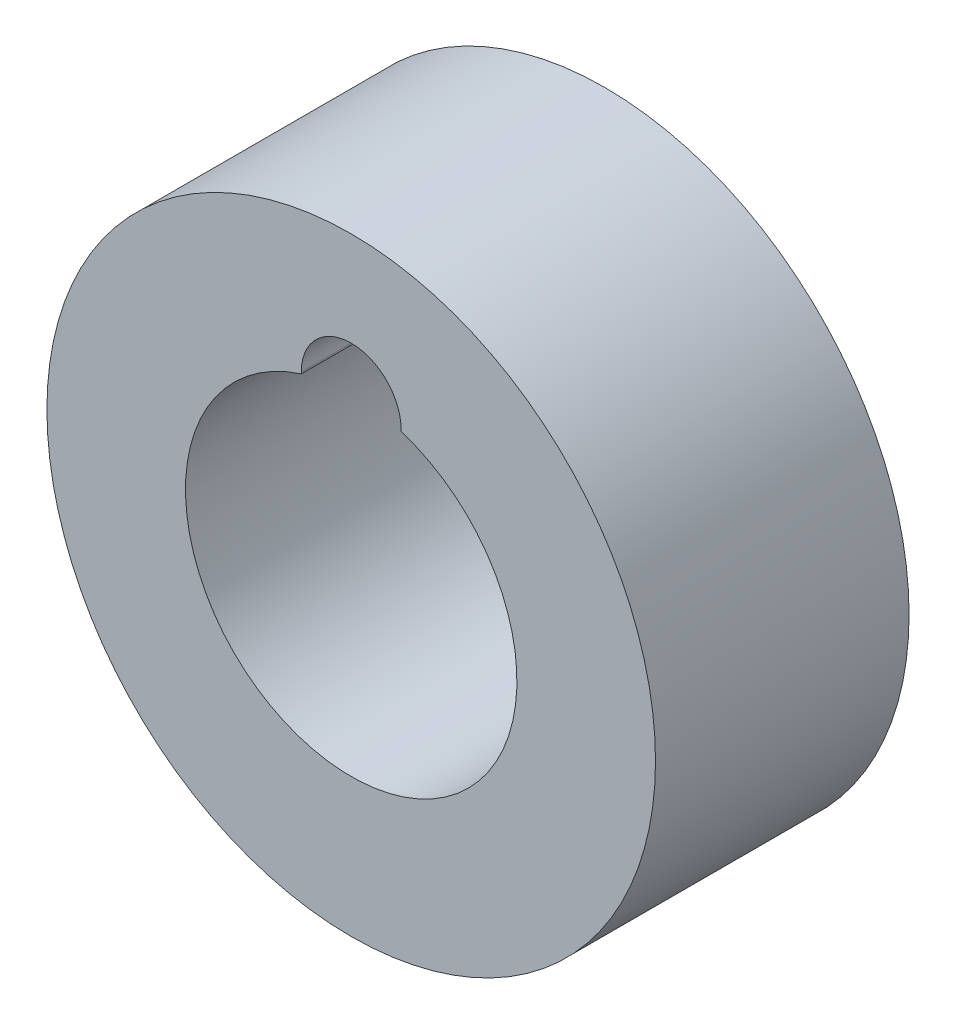
ISO-10303-21;
HEADER;
FILE_DESCRIPTION(('STEP AP214'),'2;1');
FILE_NAME('part.step','',(''),(''),'','','');
FILE_SCHEMA(('AUTOMOTIVE_DESIGN { 1 0 10303 214 1 1 1 1 }'));
ENDSEC;
DATA;
#1=APPLICATION_CONTEXT('core data for automotive mechanical design processes');
#2=APPLICATION_PROTOCOL_DEFINITION('international standard','automotive_design',2000,#1);
#3=PRODUCT_CONTEXT('',#1,'mechanical');
#4=PRODUCT('Part','Part','',(#3));
#5=PRODUCT_RELATED_PRODUCT_CATEGORY('part','',(#4));
#6=PRODUCT_DEFINITION_FORMATION('','',#4);
#7=PRODUCT_DEFINITION_CONTEXT('part definition',#1,'design');
#8=PRODUCT_DEFINITION('design','',#6,#7);
#9=PRODUCT_DEFINITION_SHAPE('','',#8);
#10=(LENGTH_UNIT() NAMED_UNIT(*) SI_UNIT(.MILLI.,.METRE.));
#11=(NAMED_UNIT(*) PLANE_ANGLE_UNIT() SI_UNIT($,.RADIAN.));
#12=(NAMED_UNIT(*) SI_UNIT($,.STERADIAN.) SOLID_ANGLE_UNIT());
#13=UNCERTAINTY_MEASURE_WITH_UNIT(LENGTH_MEASURE(1.E-05),#10,'distance_accuracy_value','');
#14=(GEOMETRIC_REPRESENTATION_CONTEXT(3) GLOBAL_UNCERTAINTY_ASSIGNED_CONTEXT((#13)) GLOBAL_UNIT_ASSIGNED_CONTEXT((#10,
#11,#12)) REPRESENTATION_CONTEXT('',''));
#15=CARTESIAN_POINT('',(0.,0.,0.));
#16=DIRECTION('',(0.,0.,1.));
#17=DIRECTION('',(1.,0.,0.));
#18=AXIS2_PLACEMENT_3D('',#15,#16,#17);
#19=CARTESIAN_POINT('',(0.,0.,6.35));
#20=DIRECTION('',(0.,0.,1.));
#21=DIRECTION('',(1.,0.,0.));
#22=AXIS2_PLACEMENT_3D('',#19,#20,#21);
#23=PLANE('',#22);
#24=DIRECTION('',(0.,-1.,0.));
#25=VECTOR('',#24,1.);
#26=CARTESIAN_POINT('',(-1.25,0.,6.35));
#27=LINE('',#26,#25);
#28=CARTESIAN_POINT('',(-1.25,4.,6.35));
#29=VERTEX_POINT('',#28);
#30=CARTESIAN_POINT('',(-1.25,3.95727178748188,6.35));
#31=VERTEX_POINT('',#30);
#32=EDGE_CURVE('E99',#29,#31,#27,.T.);
#33=ORIENTED_EDGE('',*,*,#32,.F.);
#34=CARTESIAN_POINT('',(0.,4.,6.35));
#35=DIRECTION('',(0.,0.,1.));
#36=DIRECTION('',(1.,0.,0.));
#37=AXIS2_PLACEMENT_3D('',#34,#35,#36);
#38=CIRCLE('',#37,1.25);
#39=CARTESIAN_POINT('',(1.25,4.,6.35));
#40=VERTEX_POINT('',#39);
#41=EDGE_CURVE('E103',#40,#29,#38,.T.);
#42=ORIENTED_EDGE('',*,*,#41,.F.);
#43=DIRECTION('',(0.,1.,0.));
#44=VECTOR('',#43,1.);
#45=CARTESIAN_POINT('',(1.25,0.,6.35));
#46=LINE('',#45,#44);
#47=CARTESIAN_POINT('',(1.25,3.95727178748188,6.35));
#48=VERTEX_POINT('',#47);
#49=EDGE_CURVE('E80',#48,#40,#46,.T.);
#50=ORIENTED_EDGE('',*,*,#49,.F.);
#51=CARTESIAN_POINT('',(0.,0.,6.35));
#52=DIRECTION('',(0.,0.,1.));
#53=DIRECTION('',(1.,0.,0.));
#54=AXIS2_PLACEMENT_3D('',#51,#52,#53);
#55=CIRCLE('',#54,4.15);
#56=EDGE_CURVE('E114',#31,#48,#55,.T.);
#57=ORIENTED_EDGE('',*,*,#56,.F.);
#58=EDGE_LOOP('',(#33,#42,#50,#57));
#59=FACE_BOUND('',#58,.T.);
#60=CARTESIAN_POINT('',(0.,0.,6.35));
#61=DIRECTION('',(0.,0.,1.));
#62=DIRECTION('',(1.,0.,0.));
#63=AXIS2_PLACEMENT_3D('',#60,#61,#62);
#64=CIRCLE('',#63,7.62);
#65=CARTESIAN_POINT('',(7.62,0.,6.35));
#66=VERTEX_POINT('',#65);
#67=EDGE_CURVE('E120',#66,#66,#64,.T.);
#68=ORIENTED_EDGE('',*,*,#67,.T.);
#69=EDGE_LOOP('',(#68));
#70=FACE_BOUND('',#69,.T.);
#71=ADVANCED_FACE('F37',(#59,#70),#23,.T.);
#72=CARTESIAN_POINT('',(0.,0.,0.));
#73=DIRECTION('',(0.,0.,1.));
#74=DIRECTION('',(1.,0.,0.));
#75=AXIS2_PLACEMENT_3D('',#72,#73,#74);
#76=PLANE('',#75);
#77=CARTESIAN_POINT('',(0.,0.,0.));
#78=DIRECTION('',(0.,0.,1.));
#79=DIRECTION('',(1.,0.,0.));
#80=AXIS2_PLACEMENT_3D('',#77,#78,#79);
#81=CIRCLE('',#80,7.62);
#82=CARTESIAN_POINT('',(7.62,0.,0.));
#83=VERTEX_POINT('',#82);
#84=EDGE_CURVE('E117',#83,#83,#81,.T.);
#85=ORIENTED_EDGE('',*,*,#84,.F.);
#86=EDGE_LOOP('',(#85));
#87=FACE_BOUND('',#86,.T.);
#88=CARTESIAN_POINT('',(0.,4.,0.));
#89=DIRECTION('',(0.,0.,1.));
#90=DIRECTION('',(1.,0.,0.));
#91=AXIS2_PLACEMENT_3D('',#88,#89,#90);
#92=CIRCLE('',#91,1.25);
#93=CARTESIAN_POINT('',(1.25,4.,0.));
#94=VERTEX_POINT('',#93);
#95=CARTESIAN_POINT('',(-1.25,4.,0.));
#96=VERTEX_POINT('',#95);
#97=EDGE_CURVE('E89',#94,#96,#92,.T.);
#98=ORIENTED_EDGE('',*,*,#97,.T.);
#99=DIRECTION('',(0.,-1.,0.));
#100=VECTOR('',#99,1.);
#101=CARTESIAN_POINT('',(-1.25,0.,0.));
#102=LINE('',#101,#100);
#103=CARTESIAN_POINT('',(-1.25,3.95727178748188,0.));
#104=VERTEX_POINT('',#103);
#105=EDGE_CURVE('E86',#96,#104,#102,.T.);
#106=ORIENTED_EDGE('',*,*,#105,.T.);
#107=CARTESIAN_POINT('',(0.,0.,0.));
#108=DIRECTION('',(0.,0.,1.));
#109=DIRECTION('',(1.,0.,0.));
#110=AXIS2_PLACEMENT_3D('',#107,#108,#109);
#111=CIRCLE('',#110,4.15);
#112=CARTESIAN_POINT('',(1.25,3.95727178748188,0.));
#113=VERTEX_POINT('',#112);
#114=EDGE_CURVE('E97',#104,#113,#111,.T.);
#115=ORIENTED_EDGE('',*,*,#114,.T.);
#116=DIRECTION('',(0.,1.,0.));
#117=VECTOR('',#116,1.);
#118=CARTESIAN_POINT('',(1.25,0.,0.));
#119=LINE('',#118,#117);
#120=EDGE_CURVE('E53',#113,#94,#119,.T.);
#121=ORIENTED_EDGE('',*,*,#120,.T.);
#122=EDGE_LOOP('',(#98,#106,#115,#121));
#123=FACE_BOUND('',#122,.T.);
#124=ADVANCED_FACE('F95',(#87,#123),#76,.F.);
#125=CARTESIAN_POINT('',(0.,0.,6.35));
#126=DIRECTION('',(0.,0.,-1.));
#127=DIRECTION('',(-1.,0.,0.));
#128=AXIS2_PLACEMENT_3D('',#125,#126,#127);
#129=CYLINDRICAL_SURFACE('',#128,7.62);
#130=ORIENTED_EDGE('',*,*,#67,.F.);
#131=EDGE_LOOP('',(#130));
#132=FACE_BOUND('',#131,.T.);
#133=ORIENTED_EDGE('',*,*,#84,.T.);
#134=EDGE_LOOP('',(#133));
#135=FACE_BOUND('',#134,.T.);
#136=ADVANCED_FACE('F39',(#132,#135),#129,.T.);
#137=CARTESIAN_POINT('',(0.,0.,6.35));
#138=DIRECTION('',(0.,0.,-1.));
#139=DIRECTION('',(-1.,0.,0.));
#140=AXIS2_PLACEMENT_3D('',#137,#138,#139);
#141=CYLINDRICAL_SURFACE('',#140,4.15);
#142=DIRECTION('',(0.,0.,-1.));
#143=VECTOR('',#142,1.);
#144=CARTESIAN_POINT('',(-1.25,3.95727178748188,6.35));
#145=LINE('',#144,#143);
#146=EDGE_CURVE('E11',#31,#104,#145,.T.);
#147=ORIENTED_EDGE('',*,*,#146,.F.);
#148=ORIENTED_EDGE('',*,*,#56,.T.);
#149=DIRECTION('',(0.,0.,-1.));
#150=VECTOR('',#149,1.);
#151=CARTESIAN_POINT('',(1.25,3.95727178748188,6.35));
#152=LINE('',#151,#150);
#153=EDGE_CURVE('E46',#113,#48,#152,.F.);
#154=ORIENTED_EDGE('',*,*,#153,.F.);
#155=ORIENTED_EDGE('',*,*,#114,.F.);
#156=EDGE_LOOP('',(#147,#148,#154,#155));
#157=FACE_BOUND('',#156,.T.);
#158=ADVANCED_FACE('F132',(#157),#141,.F.);
#159=CARTESIAN_POINT('',(-1.25,0.,0.));
#160=DIRECTION('',(-1.,0.,0.));
#161=DIRECTION('',(0.,0.,1.));
#162=AXIS2_PLACEMENT_3D('',#159,#160,#161);
#163=PLANE('',#162);
#164=ORIENTED_EDGE('',*,*,#146,.T.);
#165=ORIENTED_EDGE('',*,*,#105,.F.);
#166=DIRECTION('',(0.,0.,1.));
#167=VECTOR('',#166,1.);
#168=CARTESIAN_POINT('',(-1.25,4.,0.));
#169=LINE('',#168,#167);
#170=EDGE_CURVE('E85',#96,#29,#169,.T.);
#171=ORIENTED_EDGE('',*,*,#170,.T.);
#172=ORIENTED_EDGE('',*,*,#32,.T.);
#173=EDGE_LOOP('',(#164,#165,#171,#172));
#174=FACE_BOUND('',#173,.T.);
#175=ADVANCED_FACE('F134',(#174),#163,.F.);
#176=CARTESIAN_POINT('',(0.,4.,0.));
#177=DIRECTION('',(0.,0.,1.));
#178=DIRECTION('',(1.,0.,0.));
#179=AXIS2_PLACEMENT_3D('',#176,#177,#178);
#180=CYLINDRICAL_SURFACE('',#179,1.25);
#181=ORIENTED_EDGE('',*,*,#41,.T.);
#182=ORIENTED_EDGE('',*,*,#170,.F.);
#183=ORIENTED_EDGE('',*,*,#97,.F.);
#184=DIRECTION('',(0.,0.,1.));
#185=VECTOR('',#184,1.);
#186=CARTESIAN_POINT('',(1.25,4.,0.));
#187=LINE('',#186,#185);
#188=EDGE_CURVE('E76',#94,#40,#187,.T.);
#189=ORIENTED_EDGE('',*,*,#188,.T.);
#190=EDGE_LOOP('',(#181,#182,#183,#189));
#191=FACE_BOUND('',#190,.T.);
#192=ADVANCED_FACE('F90',(#191),#180,.F.);
#193=CARTESIAN_POINT('',(1.25,0.,0.));
#194=DIRECTION('',(1.,0.,0.));
#195=DIRECTION('',(0.,0.,-1.));
#196=AXIS2_PLACEMENT_3D('',#193,#194,#195);
#197=PLANE('',#196);
#198=ORIENTED_EDGE('',*,*,#153,.T.);
#199=ORIENTED_EDGE('',*,*,#49,.T.);
#200=ORIENTED_EDGE('',*,*,#188,.F.);
#201=ORIENTED_EDGE('',*,*,#120,.F.);
#202=EDGE_LOOP('',(#198,#199,#200,#201));
#203=FACE_BOUND('',#202,.T.);
#204=ADVANCED_FACE('F78',(#203),#197,.F.);
#205=CLOSED_SHELL('',(#71,#124,#136,#158,#175,#192,#204));
#206=MANIFOLD_SOLID_BREP('B2',#205);
#207=ADVANCED_BREP_SHAPE_REPRESENTATION('',(#18,#206),#14);
#208=SHAPE_DEFINITION_REPRESENTATION(#9,#207);
ENDSEC;
END-ISO-10303-21;
